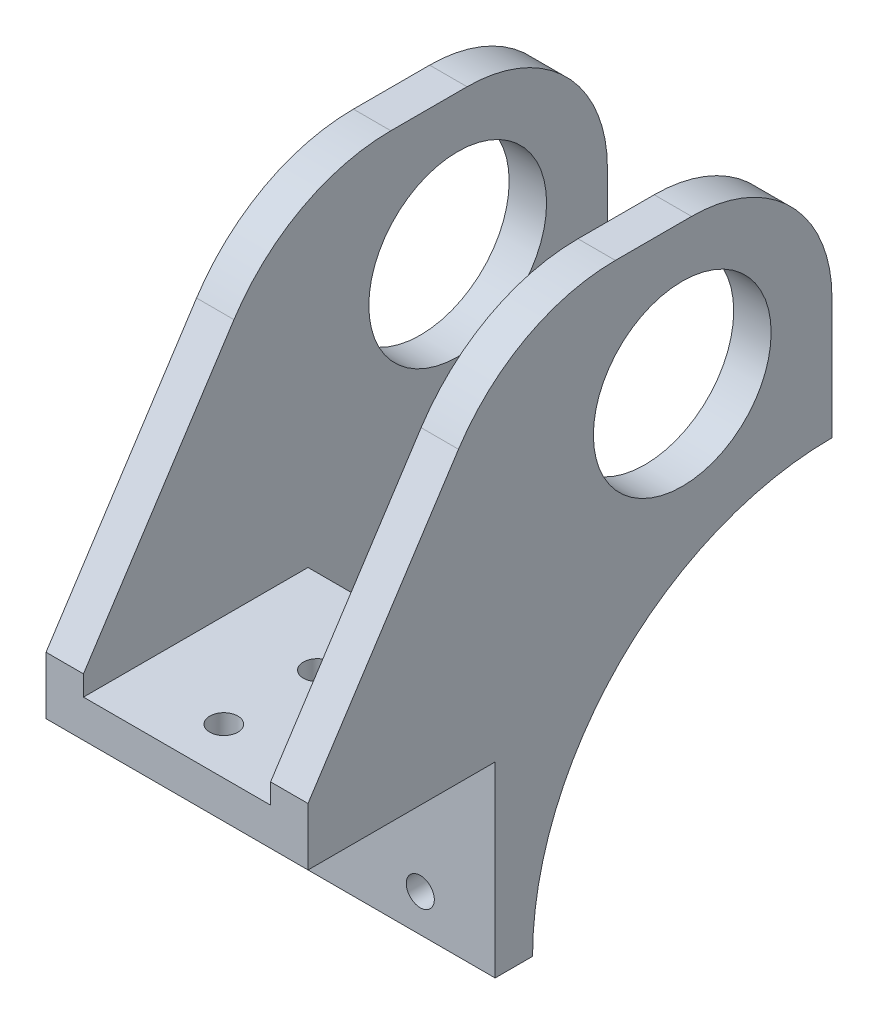
ISO-10303-21;
HEADER;
FILE_DESCRIPTION(('STEP AP214'),'2;1');
FILE_NAME('part.step','',(''),(''),'','','');
FILE_SCHEMA(('AUTOMOTIVE_DESIGN { 1 0 10303 214 1 1 1 1 }'));
ENDSEC;
DATA;
#1=APPLICATION_CONTEXT('core data for automotive mechanical design processes');
#2=APPLICATION_PROTOCOL_DEFINITION('international standard','automotive_design',2000,#1);
#3=PRODUCT_CONTEXT('',#1,'mechanical');
#4=PRODUCT('Part','Part','',(#3));
#5=PRODUCT_RELATED_PRODUCT_CATEGORY('part','',(#4));
#6=PRODUCT_DEFINITION_FORMATION('','',#4);
#7=PRODUCT_DEFINITION_CONTEXT('part definition',#1,'design');
#8=PRODUCT_DEFINITION('design','',#6,#7);
#9=PRODUCT_DEFINITION_SHAPE('','',#8);
#10=(LENGTH_UNIT() NAMED_UNIT(*) SI_UNIT(.MILLI.,.METRE.));
#11=(NAMED_UNIT(*) PLANE_ANGLE_UNIT() SI_UNIT($,.RADIAN.));
#12=(NAMED_UNIT(*) SI_UNIT($,.STERADIAN.) SOLID_ANGLE_UNIT());
#13=UNCERTAINTY_MEASURE_WITH_UNIT(LENGTH_MEASURE(1.E-05),#10,'distance_accuracy_value','');
#14=(GEOMETRIC_REPRESENTATION_CONTEXT(3) GLOBAL_UNCERTAINTY_ASSIGNED_CONTEXT((#13)) GLOBAL_UNIT_ASSIGNED_CONTEXT((#10,
#11,#12)) REPRESENTATION_CONTEXT('',''));
#15=CARTESIAN_POINT('',(0.,0.,0.));
#16=DIRECTION('',(0.,0.,1.));
#17=DIRECTION('',(1.,0.,0.));
#18=AXIS2_PLACEMENT_3D('',#15,#16,#17);
#19=CARTESIAN_POINT('',(52.,-2.00000000000001,-7.99961894323343));
#20=DIRECTION('',(0.,-0.544991158096032,-0.838441791418549));
#21=DIRECTION('',(0.,0.838441791418549,-0.544991158096032));
#22=AXIS2_PLACEMENT_3D('',#19,#20,#21);
#23=PLANE('',#22);
#24=DIRECTION('',(0.,-0.838441791418549,0.544991158096032));
#25=VECTOR('',#24,1.);
#26=CARTESIAN_POINT('',(22.,-2.00000000000001,-7.99961894323343));
#27=LINE('',#26,#25);
#28=CARTESIAN_POINT('',(22.,28.8998231619206,-28.0846511808156));
#29=VERTEX_POINT('',#28);
#30=CARTESIAN_POINT('',(22.,4.15380105870128,-11.9996189432334));
#31=VERTEX_POINT('',#30);
#32=EDGE_CURVE('E237',#29,#31,#27,.T.);
#33=ORIENTED_EDGE('',*,*,#32,.T.);
#34=DIRECTION('',(1.,0.,0.));
#35=VECTOR('',#34,1.);
#36=CARTESIAN_POINT('',(52.,4.15380105870128,-11.9996189432334));
#37=LINE('',#36,#35);
#38=CARTESIAN_POINT('',(26.,4.15380105870127,-11.9996189432334));
#39=VERTEX_POINT('',#38);
#40=EDGE_CURVE('E189',#31,#39,#37,.T.);
#41=ORIENTED_EDGE('',*,*,#40,.T.);
#42=DIRECTION('',(0.,0.838441791418549,-0.544991158096032));
#43=VECTOR('',#42,1.);
#44=CARTESIAN_POINT('',(26.,-4.24940350665579,-6.53749594952683));
#45=LINE('',#44,#43);
#46=CARTESIAN_POINT('',(26.,28.8998231619206,-28.0846511808156));
#47=VERTEX_POINT('',#46);
#48=EDGE_CURVE('E309',#39,#47,#45,.T.);
#49=ORIENTED_EDGE('',*,*,#48,.T.);
#50=DIRECTION('',(-1.,0.,0.));
#51=VECTOR('',#50,1.);
#52=CARTESIAN_POINT('',(52.,28.8998231619206,-28.0846511808156));
#53=LINE('',#52,#51);
#54=EDGE_CURVE('E322',#47,#29,#53,.T.);
#55=ORIENTED_EDGE('',*,*,#54,.T.);
#56=EDGE_LOOP('',(#33,#41,#49,#55));
#57=FACE_BOUND('',#56,.T.);
#58=ADVANCED_FACE('F39',(#57),#23,.F.);
#59=CARTESIAN_POINT('',(0.,0.,-36.));
#60=DIRECTION('',(0.,0.,1.));
#61=DIRECTION('',(1.,0.,0.));
#62=AXIS2_PLACEMENT_3D('',#59,#60,#61);
#63=PLANE('',#62);
#64=CARTESIAN_POINT('',(30.0000000000001,-17.9999999999999,-36.));
#65=DIRECTION('',(0.,0.,1.));
#66=DIRECTION('',(1.,0.,0.));
#67=AXIS2_PLACEMENT_3D('',#64,#65,#66);
#68=CIRCLE('',#67,1.50000000000001);
#69=CARTESIAN_POINT('',(31.5000000000001,-17.9999999999999,-36.));
#70=VERTEX_POINT('',#69);
#71=EDGE_CURVE('E258',#70,#70,#68,.T.);
#72=ORIENTED_EDGE('',*,*,#71,.T.);
#73=EDGE_LOOP('',(#72));
#74=FACE_BOUND('',#73,.T.);
#75=CARTESIAN_POINT('',(42.0000000000001,-17.9999999999999,-36.));
#76=DIRECTION('',(0.,0.,1.));
#77=DIRECTION('',(1.,0.,0.));
#78=AXIS2_PLACEMENT_3D('',#75,#76,#77);
#79=CIRCLE('',#78,1.5);
#80=CARTESIAN_POINT('',(43.5000000000001,-17.9999999999999,-36.));
#81=VERTEX_POINT('',#80);
#82=EDGE_CURVE('E254',#81,#81,#79,.T.);
#83=ORIENTED_EDGE('',*,*,#82,.T.);
#84=EDGE_LOOP('',(#83));
#85=FACE_BOUND('',#84,.T.);
#86=CARTESIAN_POINT('',(42.,-5.99999999999986,-36.));
#87=DIRECTION('',(0.,0.,1.));
#88=DIRECTION('',(1.,0.,0.));
#89=AXIS2_PLACEMENT_3D('',#86,#87,#88);
#90=CIRCLE('',#89,1.5);
#91=CARTESIAN_POINT('',(43.5,-5.99999999999986,-36.));
#92=VERTEX_POINT('',#91);
#93=EDGE_CURVE('E250',#92,#92,#90,.T.);
#94=ORIENTED_EDGE('',*,*,#93,.T.);
#95=EDGE_LOOP('',(#94));
#96=FACE_BOUND('',#95,.T.);
#97=CARTESIAN_POINT('',(30.,-6.00000000000001,-36.));
#98=DIRECTION('',(0.,0.,1.));
#99=DIRECTION('',(1.,0.,0.));
#100=AXIS2_PLACEMENT_3D('',#97,#98,#99);
#101=CIRCLE('',#100,1.5);
#102=CARTESIAN_POINT('',(31.5,-6.00000000000001,-36.));
#103=VERTEX_POINT('',#102);
#104=EDGE_CURVE('E246',#103,#103,#101,.T.);
#105=ORIENTED_EDGE('',*,*,#104,.T.);
#106=EDGE_LOOP('',(#105));
#107=FACE_BOUND('',#106,.T.);
#108=DIRECTION('',(0.,-1.,0.));
#109=VECTOR('',#108,1.);
#110=CARTESIAN_POINT('',(46.,2.,-36.));
#111=LINE('',#110,#109);
#112=CARTESIAN_POINT('',(46.,2.,-36.));
#113=VERTEX_POINT('',#112);
#114=CARTESIAN_POINT('',(46.,-22.,-36.));
#115=VERTEX_POINT('',#114);
#116=EDGE_CURVE('E261',#113,#115,#111,.T.);
#117=ORIENTED_EDGE('',*,*,#116,.T.);
#118=DIRECTION('',(1.,0.,0.));
#119=VECTOR('',#118,1.);
#120=CARTESIAN_POINT('',(30.,-22.,-36.));
#121=LINE('',#120,#119);
#122=CARTESIAN_POINT('',(26.,-22.,-36.));
#123=VERTEX_POINT('',#122);
#124=EDGE_CURVE('E288',#123,#115,#121,.T.);
#125=ORIENTED_EDGE('',*,*,#124,.F.);
#126=DIRECTION('',(0.,1.,0.));
#127=VECTOR('',#126,1.);
#128=CARTESIAN_POINT('',(26.,1.99999999999999,-36.));
#129=LINE('',#128,#127);
#130=CARTESIAN_POINT('',(26.,1.99999999999999,-36.));
#131=VERTEX_POINT('',#130);
#132=EDGE_CURVE('E266',#123,#131,#129,.T.);
#133=ORIENTED_EDGE('',*,*,#132,.T.);
#134=DIRECTION('',(1.,0.,0.));
#135=VECTOR('',#134,1.);
#136=CARTESIAN_POINT('',(0.,2.,-36.));
#137=LINE('',#136,#135);
#138=EDGE_CURVE('E295',#131,#113,#137,.T.);
#139=ORIENTED_EDGE('',*,*,#138,.T.);
#140=EDGE_LOOP('',(#117,#125,#133,#139));
#141=FACE_BOUND('',#140,.T.);
#142=ADVANCED_FACE('F385',(#74,#85,#96,#107,#141),#63,.F.);
#143=CARTESIAN_POINT('',(30.,38.,40.));
#144=DIRECTION('',(0.,-1.,0.));
#145=DIRECTION('',(0.,0.,-1.));
#146=AXIS2_PLACEMENT_3D('',#143,#144,#145);
#147=PLANE('',#146);
#148=DIRECTION('',(0.,0.,1.));
#149=VECTOR('',#148,1.);
#150=CARTESIAN_POINT('',(26.,38.,-58.));
#151=LINE('',#150,#149);
#152=CARTESIAN_POINT('',(26.,38.,-53.));
#153=VERTEX_POINT('',#152);
#154=CARTESIAN_POINT('',(26.,38.,-44.8534870091866));
#155=VERTEX_POINT('',#154);
#156=EDGE_CURVE('E271',#153,#155,#151,.T.);
#157=ORIENTED_EDGE('',*,*,#156,.F.);
#158=DIRECTION('',(1.,0.,0.));
#159=VECTOR('',#158,1.);
#160=CARTESIAN_POINT('',(22.,38.,-53.));
#161=LINE('',#160,#159);
#162=CARTESIAN_POINT('',(22.,38.,-53.));
#163=VERTEX_POINT('',#162);
#164=EDGE_CURVE('E47',#153,#163,#161,.F.);
#165=ORIENTED_EDGE('',*,*,#164,.T.);
#166=DIRECTION('',(0.,0.,-1.));
#167=VECTOR('',#166,1.);
#168=CARTESIAN_POINT('',(22.,38.,-7.99961894323343));
#169=LINE('',#168,#167);
#170=CARTESIAN_POINT('',(22.,38.,-44.8534870091866));
#171=VERTEX_POINT('',#170);
#172=EDGE_CURVE('E273',#171,#163,#169,.T.);
#173=ORIENTED_EDGE('',*,*,#172,.F.);
#174=DIRECTION('',(-1.,0.,0.));
#175=VECTOR('',#174,1.);
#176=CARTESIAN_POINT('',(30.,38.,-44.8534870091866));
#177=LINE('',#176,#175);
#178=EDGE_CURVE('E327',#171,#155,#177,.F.);
#179=ORIENTED_EDGE('',*,*,#178,.T.);
#180=EDGE_LOOP('',(#157,#165,#173,#179));
#181=FACE_BOUND('',#180,.T.);
#182=ADVANCED_FACE('F394',(#181),#147,.F.);
#183=CARTESIAN_POINT('',(0.,-2.00000000000001,0.));
#184=DIRECTION('',(0.,-1.,0.));
#185=DIRECTION('',(1.,0.,0.));
#186=AXIS2_PLACEMENT_3D('',#183,#184,#185);
#187=PLANE('',#186);
#188=CARTESIAN_POINT('',(36.,-2.,-16.9996189432334));
#189=DIRECTION('',(0.,-1.,0.));
#190=DIRECTION('',(1.,0.,0.));
#191=AXIS2_PLACEMENT_3D('',#188,#189,#190);
#192=CIRCLE('',#191,1.5);
#193=CARTESIAN_POINT('',(37.5,-2.,-16.9996189432334));
#194=VERTEX_POINT('',#193);
#195=EDGE_CURVE('E216',#194,#194,#192,.T.);
#196=ORIENTED_EDGE('',*,*,#195,.F.);
#197=EDGE_LOOP('',(#196));
#198=FACE_BOUND('',#197,.T.);
#199=CARTESIAN_POINT('',(36.,-2.,-26.9996189432334));
#200=DIRECTION('',(0.,-1.,0.));
#201=DIRECTION('',(1.,0.,0.));
#202=AXIS2_PLACEMENT_3D('',#199,#200,#201);
#203=CIRCLE('',#202,1.5);
#204=CARTESIAN_POINT('',(37.5,-2.,-26.9996189432334));
#205=VERTEX_POINT('',#204);
#206=EDGE_CURVE('E215',#205,#205,#203,.T.);
#207=ORIENTED_EDGE('',*,*,#206,.F.);
#208=EDGE_LOOP('',(#207));
#209=FACE_BOUND('',#208,.T.);
#210=DIRECTION('',(1.,0.,0.));
#211=VECTOR('',#210,1.);
#212=CARTESIAN_POINT('',(22.,-2.00000000000001,-11.9996189432334));
#213=LINE('',#212,#211);
#214=CARTESIAN_POINT('',(22.,-2.00000000000001,-11.9996189432334));
#215=VERTEX_POINT('',#214);
#216=CARTESIAN_POINT('',(50.,-2.,-11.9996189432334));
#217=VERTEX_POINT('',#216);
#218=EDGE_CURVE('E222',#215,#217,#213,.T.);
#219=ORIENTED_EDGE('',*,*,#218,.F.);
#220=DIRECTION('',(0.,0.,1.));
#221=VECTOR('',#220,1.);
#222=CARTESIAN_POINT('',(22.,-2.,-32.));
#223=LINE('',#222,#221);
#224=CARTESIAN_POINT('',(22.,-2.,-32.));
#225=VERTEX_POINT('',#224);
#226=EDGE_CURVE('E281',#225,#215,#223,.T.);
#227=ORIENTED_EDGE('',*,*,#226,.F.);
#228=DIRECTION('',(-1.,0.,0.));
#229=VECTOR('',#228,1.);
#230=CARTESIAN_POINT('',(30.,-2.,-32.));
#231=LINE('',#230,#229);
#232=CARTESIAN_POINT('',(50.,-2.,-32.));
#233=VERTEX_POINT('',#232);
#234=EDGE_CURVE('E284',#233,#225,#231,.T.);
#235=ORIENTED_EDGE('',*,*,#234,.F.);
#236=DIRECTION('',(0.,0.,1.));
#237=VECTOR('',#236,1.);
#238=CARTESIAN_POINT('',(50.,-2.,-40.));
#239=LINE('',#238,#237);
#240=EDGE_CURVE('E298',#233,#217,#239,.T.);
#241=ORIENTED_EDGE('',*,*,#240,.T.);
#242=EDGE_LOOP('',(#219,#227,#235,#241));
#243=FACE_BOUND('',#242,.T.);
#244=ADVANCED_FACE('F444',(#198,#209,#243),#187,.T.);
#245=CARTESIAN_POINT('',(50.,38.,40.));
#246=DIRECTION('',(-1.,0.,0.));
#247=DIRECTION('',(0.,-1.,0.));
#248=AXIS2_PLACEMENT_3D('',#245,#246,#247);
#249=PLANE('',#248);
#250=CARTESIAN_POINT('',(50.,23.,-51.9996189432334));
#251=DIRECTION('',(1.,0.,0.));
#252=DIRECTION('',(0.,1.,0.));
#253=AXIS2_PLACEMENT_3D('',#250,#251,#252);
#254=CIRCLE('',#253,9.5);
#255=CARTESIAN_POINT('',(50.,32.5,-51.9996189432334));
#256=VERTEX_POINT('',#255);
#257=EDGE_CURVE('E349',#256,#256,#254,.T.);
#258=ORIENTED_EDGE('',*,*,#257,.F.);
#259=EDGE_LOOP('',(#258));
#260=FACE_BOUND('',#259,.T.);
#261=DIRECTION('',(0.,-1.,0.));
#262=VECTOR('',#261,1.);
#263=CARTESIAN_POINT('',(50.,38.,-68.));
#264=LINE('',#263,#262);
#265=CARTESIAN_POINT('',(50.,23.,-68.));
#266=VERTEX_POINT('',#265);
#267=CARTESIAN_POINT('',(50.,10.,-68.));
#268=VERTEX_POINT('',#267);
#269=EDGE_CURVE('E170',#266,#268,#264,.T.);
#270=ORIENTED_EDGE('',*,*,#269,.F.);
#271=CARTESIAN_POINT('',(50.,23.,-53.));
#272=DIRECTION('',(-1.,0.,0.));
#273=DIRECTION('',(0.,-1.,0.));
#274=AXIS2_PLACEMENT_3D('',#271,#272,#273);
#275=CIRCLE('',#274,15.);
#276=CARTESIAN_POINT('',(50.,38.,-53.));
#277=VERTEX_POINT('',#276);
#278=EDGE_CURVE('E351',#266,#277,#275,.F.);
#279=ORIENTED_EDGE('',*,*,#278,.T.);
#280=DIRECTION('',(0.,0.,-1.));
#281=VECTOR('',#280,1.);
#282=CARTESIAN_POINT('',(50.,38.,40.));
#283=LINE('',#282,#281);
#284=CARTESIAN_POINT('',(50.,38.,-44.8534870091866));
#285=VERTEX_POINT('',#284);
#286=EDGE_CURVE('E306',#285,#277,#283,.T.);
#287=ORIENTED_EDGE('',*,*,#286,.F.);
#288=CARTESIAN_POINT('',(50.,18.,-44.8534870091866));
#289=DIRECTION('',(-1.,0.,0.));
#290=DIRECTION('',(0.,-1.,0.));
#291=AXIS2_PLACEMENT_3D('',#288,#289,#290);
#292=CIRCLE('',#291,20.);
#293=CARTESIAN_POINT('',(50.,28.8998231619206,-28.0846511808156));
#294=VERTEX_POINT('',#293);
#295=EDGE_CURVE('E337',#285,#294,#292,.F.);
#296=ORIENTED_EDGE('',*,*,#295,.T.);
#297=DIRECTION('',(0.,-0.838441791418549,0.544991158096032));
#298=VECTOR('',#297,1.);
#299=CARTESIAN_POINT('',(50.,4.18627820598348,-12.0207292436623));
#300=LINE('',#299,#298);
#301=CARTESIAN_POINT('',(50.,4.15380105870127,-11.9996189432334));
#302=VERTEX_POINT('',#301);
#303=EDGE_CURVE('E242',#294,#302,#300,.T.);
#304=ORIENTED_EDGE('',*,*,#303,.T.);
#305=DIRECTION('',(0.,-1.,0.));
#306=VECTOR('',#305,1.);
#307=CARTESIAN_POINT('',(50.,8.,-11.9996189432334));
#308=LINE('',#307,#306);
#309=EDGE_CURVE('E226',#302,#217,#308,.T.);
#310=ORIENTED_EDGE('',*,*,#309,.T.);
#311=ORIENTED_EDGE('',*,*,#240,.F.);
#312=DIRECTION('',(0.,1.,0.));
#313=VECTOR('',#312,1.);
#314=CARTESIAN_POINT('',(50.,-22.,-32.));
#315=LINE('',#314,#313);
#316=CARTESIAN_POINT('',(50.,-22.,-32.));
#317=VERTEX_POINT('',#316);
#318=EDGE_CURVE('E292',#317,#233,#315,.T.);
#319=ORIENTED_EDGE('',*,*,#318,.F.);
#320=DIRECTION('',(0.,0.,1.));
#321=VECTOR('',#320,1.);
#322=CARTESIAN_POINT('',(50.,-22.,-36.));
#323=LINE('',#322,#321);
#324=CARTESIAN_POINT('',(50.,-22.,-36.));
#325=VERTEX_POINT('',#324);
#326=EDGE_CURVE('E194',#325,#317,#323,.T.);
#327=ORIENTED_EDGE('',*,*,#326,.F.);
#328=CARTESIAN_POINT('',(50.,-22.,-68.));
#329=DIRECTION('',(1.,0.,0.));
#330=DIRECTION('',(0.,1.,0.));
#331=AXIS2_PLACEMENT_3D('',#328,#329,#330);
#332=CIRCLE('',#331,32.);
#333=EDGE_CURVE('E185',#268,#325,#332,.T.);
#334=ORIENTED_EDGE('',*,*,#333,.F.);
#335=EDGE_LOOP('',(#270,#279,#287,#296,#304,#310,#311,#319,#327,#334));
#336=FACE_BOUND('',#335,.T.);
#337=ADVANCED_FACE('F192',(#260,#336),#249,.F.);
#338=CARTESIAN_POINT('',(46.,0.,40.));
#339=DIRECTION('',(1.,0.,0.));
#340=DIRECTION('',(0.,0.,-1.));
#341=AXIS2_PLACEMENT_3D('',#338,#339,#340);
#342=PLANE('',#341);
#343=CARTESIAN_POINT('',(46.,23.,-51.9996189432334));
#344=DIRECTION('',(1.,0.,0.));
#345=DIRECTION('',(0.,0.,-1.));
#346=AXIS2_PLACEMENT_3D('',#343,#344,#345);
#347=CIRCLE('',#346,9.5);
#348=CARTESIAN_POINT('',(46.,23.,-61.4996189432334));
#349=VERTEX_POINT('',#348);
#350=EDGE_CURVE('E195',#349,#349,#347,.T.);
#351=ORIENTED_EDGE('',*,*,#350,.T.);
#352=EDGE_LOOP('',(#351));
#353=FACE_BOUND('',#352,.T.);
#354=DIRECTION('',(0.,0.,-1.));
#355=VECTOR('',#354,1.);
#356=CARTESIAN_POINT('',(46.,38.,40.));
#357=LINE('',#356,#355);
#358=CARTESIAN_POINT('',(46.,38.,-44.8534870091866));
#359=VERTEX_POINT('',#358);
#360=CARTESIAN_POINT('',(46.,38.,-53.));
#361=VERTEX_POINT('',#360);
#362=EDGE_CURVE('E303',#359,#361,#357,.T.);
#363=ORIENTED_EDGE('',*,*,#362,.T.);
#364=CARTESIAN_POINT('',(46.,23.,-53.));
#365=DIRECTION('',(1.,0.,0.));
#366=DIRECTION('',(0.,0.,-1.));
#367=AXIS2_PLACEMENT_3D('',#364,#365,#366);
#368=CIRCLE('',#367,15.);
#369=CARTESIAN_POINT('',(46.,23.,-68.));
#370=VERTEX_POINT('',#369);
#371=EDGE_CURVE('E355',#361,#370,#368,.F.);
#372=ORIENTED_EDGE('',*,*,#371,.T.);
#373=DIRECTION('',(0.,1.,0.));
#374=VECTOR('',#373,1.);
#375=CARTESIAN_POINT('',(46.,2.,-68.));
#376=LINE('',#375,#374);
#377=CARTESIAN_POINT('',(46.,10.,-68.));
#378=VERTEX_POINT('',#377);
#379=EDGE_CURVE('E181',#378,#370,#376,.T.);
#380=ORIENTED_EDGE('',*,*,#379,.F.);
#381=CARTESIAN_POINT('',(46.,-22.,-68.));
#382=DIRECTION('',(1.,0.,0.));
#383=DIRECTION('',(0.,0.,-1.));
#384=AXIS2_PLACEMENT_3D('',#381,#382,#383);
#385=CIRCLE('',#384,32.);
#386=EDGE_CURVE('E188',#378,#115,#385,.T.);
#387=ORIENTED_EDGE('',*,*,#386,.T.);
#388=ORIENTED_EDGE('',*,*,#116,.F.);
#389=DIRECTION('',(0.,0.,-1.));
#390=VECTOR('',#389,1.);
#391=CARTESIAN_POINT('',(46.,2.,-3.99961894323343));
#392=LINE('',#391,#390);
#393=CARTESIAN_POINT('',(46.,2.,-11.9996189432334));
#394=VERTEX_POINT('',#393);
#395=EDGE_CURVE('E301',#394,#113,#392,.T.);
#396=ORIENTED_EDGE('',*,*,#395,.F.);
#397=DIRECTION('',(0.,1.,0.));
#398=VECTOR('',#397,1.);
#399=CARTESIAN_POINT('',(46.,0.,-11.9996189432334));
#400=LINE('',#399,#398);
#401=CARTESIAN_POINT('',(46.,4.15380105870128,-11.9996189432334));
#402=VERTEX_POINT('',#401);
#403=EDGE_CURVE('E229',#394,#402,#400,.T.);
#404=ORIENTED_EDGE('',*,*,#403,.T.);
#405=DIRECTION('',(0.,0.838441791418549,-0.544991158096032));
#406=VECTOR('',#405,1.);
#407=CARTESIAN_POINT('',(46.,-22.5271380227081,5.34311854658733));
#408=LINE('',#407,#406);
#409=CARTESIAN_POINT('',(46.,28.8998231619206,-28.0846511808156));
#410=VERTEX_POINT('',#409);
#411=EDGE_CURVE('E240',#402,#410,#408,.T.);
#412=ORIENTED_EDGE('',*,*,#411,.T.);
#413=CARTESIAN_POINT('',(46.,18.,-44.8534870091866));
#414=DIRECTION('',(1.,0.,0.));
#415=DIRECTION('',(0.,0.,-1.));
#416=AXIS2_PLACEMENT_3D('',#413,#414,#415);
#417=CIRCLE('',#416,20.);
#418=EDGE_CURVE('E333',#410,#359,#417,.F.);
#419=ORIENTED_EDGE('',*,*,#418,.T.);
#420=EDGE_LOOP('',(#363,#372,#380,#387,#388,#396,#404,#412,#419));
#421=FACE_BOUND('',#420,.T.);
#422=ADVANCED_FACE('F418',(#353,#421),#342,.F.);
#423=CARTESIAN_POINT('',(0.,2.,0.));
#424=DIRECTION('',(0.,1.,0.));
#425=DIRECTION('',(0.,0.,1.));
#426=AXIS2_PLACEMENT_3D('',#423,#424,#425);
#427=PLANE('',#426);
#428=CARTESIAN_POINT('',(36.,2.,-16.9996189432334));
#429=DIRECTION('',(0.,1.,0.));
#430=DIRECTION('',(0.,0.,1.));
#431=AXIS2_PLACEMENT_3D('',#428,#429,#430);
#432=CIRCLE('',#431,1.5);
#433=CARTESIAN_POINT('',(36.,2.,-15.4996189432334));
#434=VERTEX_POINT('',#433);
#435=EDGE_CURVE('E225',#434,#434,#432,.T.);
#436=ORIENTED_EDGE('',*,*,#435,.F.);
#437=EDGE_LOOP('',(#436));
#438=FACE_BOUND('',#437,.T.);
#439=CARTESIAN_POINT('',(36.,2.,-26.9996189432334));
#440=DIRECTION('',(0.,1.,0.));
#441=DIRECTION('',(0.,0.,1.));
#442=AXIS2_PLACEMENT_3D('',#439,#440,#441);
#443=CIRCLE('',#442,1.5);
#444=CARTESIAN_POINT('',(36.,2.,-25.4996189432334));
#445=VERTEX_POINT('',#444);
#446=EDGE_CURVE('E219',#445,#445,#443,.T.);
#447=ORIENTED_EDGE('',*,*,#446,.F.);
#448=EDGE_LOOP('',(#447));
#449=FACE_BOUND('',#448,.T.);
#450=DIRECTION('',(-1.,0.,0.));
#451=VECTOR('',#450,1.);
#452=CARTESIAN_POINT('',(0.,2.,-11.9996189432334));
#453=LINE('',#452,#451);
#454=CARTESIAN_POINT('',(26.,2.,-11.9996189432334));
#455=VERTEX_POINT('',#454);
#456=EDGE_CURVE('E233',#394,#455,#453,.T.);
#457=ORIENTED_EDGE('',*,*,#456,.F.);
#458=ORIENTED_EDGE('',*,*,#395,.T.);
#459=ORIENTED_EDGE('',*,*,#138,.F.);
#460=DIRECTION('',(0.,0.,-1.));
#461=VECTOR('',#460,1.);
#462=CARTESIAN_POINT('',(26.,2.,-7.99961894323343));
#463=LINE('',#462,#461);
#464=EDGE_CURVE('E269',#455,#131,#463,.T.);
#465=ORIENTED_EDGE('',*,*,#464,.F.);
#466=EDGE_LOOP('',(#457,#458,#459,#465));
#467=FACE_BOUND('',#466,.T.);
#468=ADVANCED_FACE('F458',(#438,#449,#467),#427,.T.);
#469=CARTESIAN_POINT('',(46.,38.,40.));
#470=DIRECTION('',(0.,-1.,0.));
#471=DIRECTION('',(0.,0.,-1.));
#472=AXIS2_PLACEMENT_3D('',#469,#470,#471);
#473=PLANE('',#472);
#474=ORIENTED_EDGE('',*,*,#286,.T.);
#475=DIRECTION('',(1.,0.,0.));
#476=VECTOR('',#475,1.);
#477=CARTESIAN_POINT('',(46.,38.,-53.));
#478=LINE('',#477,#476);
#479=EDGE_CURVE('E353',#277,#361,#478,.F.);
#480=ORIENTED_EDGE('',*,*,#479,.T.);
#481=ORIENTED_EDGE('',*,*,#362,.F.);
#482=DIRECTION('',(-1.,0.,0.));
#483=VECTOR('',#482,1.);
#484=CARTESIAN_POINT('',(46.,38.,-44.8534870091866));
#485=LINE('',#484,#483);
#486=EDGE_CURVE('E335',#359,#285,#485,.F.);
#487=ORIENTED_EDGE('',*,*,#486,.T.);
#488=EDGE_LOOP('',(#474,#480,#481,#487));
#489=FACE_BOUND('',#488,.T.);
#490=ADVANCED_FACE('F426',(#489),#473,.F.);
#491=CARTESIAN_POINT('',(30.,-22.,-32.));
#492=DIRECTION('',(0.,0.,-1.));
#493=DIRECTION('',(-1.,0.,0.));
#494=AXIS2_PLACEMENT_3D('',#491,#492,#493);
#495=PLANE('',#494);
#496=CARTESIAN_POINT('',(30.0000000000001,-17.9999999999999,-32.));
#497=DIRECTION('',(0.,0.,-1.));
#498=DIRECTION('',(-1.,0.,0.));
#499=AXIS2_PLACEMENT_3D('',#496,#497,#498);
#500=CIRCLE('',#499,1.50000000000001);
#501=CARTESIAN_POINT('',(28.5000000000001,-17.9999999999999,-32.));
#502=VERTEX_POINT('',#501);
#503=EDGE_CURVE('E257',#502,#502,#500,.T.);
#504=ORIENTED_EDGE('',*,*,#503,.T.);
#505=EDGE_LOOP('',(#504));
#506=FACE_BOUND('',#505,.T.);
#507=CARTESIAN_POINT('',(42.0000000000001,-17.9999999999999,-32.));
#508=DIRECTION('',(0.,0.,-1.));
#509=DIRECTION('',(-1.,0.,0.));
#510=AXIS2_PLACEMENT_3D('',#507,#508,#509);
#511=CIRCLE('',#510,1.5);
#512=CARTESIAN_POINT('',(40.5000000000001,-17.9999999999999,-32.));
#513=VERTEX_POINT('',#512);
#514=EDGE_CURVE('E253',#513,#513,#511,.T.);
#515=ORIENTED_EDGE('',*,*,#514,.T.);
#516=EDGE_LOOP('',(#515));
#517=FACE_BOUND('',#516,.T.);
#518=CARTESIAN_POINT('',(42.,-5.99999999999986,-32.));
#519=DIRECTION('',(0.,0.,-1.));
#520=DIRECTION('',(-1.,0.,0.));
#521=AXIS2_PLACEMENT_3D('',#518,#519,#520);
#522=CIRCLE('',#521,1.5);
#523=CARTESIAN_POINT('',(40.5,-5.99999999999986,-32.));
#524=VERTEX_POINT('',#523);
#525=EDGE_CURVE('E249',#524,#524,#522,.T.);
#526=ORIENTED_EDGE('',*,*,#525,.T.);
#527=EDGE_LOOP('',(#526));
#528=FACE_BOUND('',#527,.T.);
#529=CARTESIAN_POINT('',(30.,-6.00000000000001,-32.));
#530=DIRECTION('',(0.,0.,-1.));
#531=DIRECTION('',(-1.,0.,0.));
#532=AXIS2_PLACEMENT_3D('',#529,#530,#531);
#533=CIRCLE('',#532,1.5);
#534=CARTESIAN_POINT('',(28.5,-6.00000000000001,-32.));
#535=VERTEX_POINT('',#534);
#536=EDGE_CURVE('E245',#535,#535,#533,.T.);
#537=ORIENTED_EDGE('',*,*,#536,.T.);
#538=EDGE_LOOP('',(#537));
#539=FACE_BOUND('',#538,.T.);
#540=ORIENTED_EDGE('',*,*,#234,.T.);
#541=DIRECTION('',(0.,1.,0.));
#542=VECTOR('',#541,1.);
#543=CARTESIAN_POINT('',(22.,-22.,-32.));
#544=LINE('',#543,#542);
#545=CARTESIAN_POINT('',(22.,-22.,-32.));
#546=VERTEX_POINT('',#545);
#547=EDGE_CURVE('E278',#546,#225,#544,.T.);
#548=ORIENTED_EDGE('',*,*,#547,.F.);
#549=DIRECTION('',(-1.,0.,0.));
#550=VECTOR('',#549,1.);
#551=CARTESIAN_POINT('',(30.,-22.,-32.));
#552=LINE('',#551,#550);
#553=EDGE_CURVE('E290',#317,#546,#552,.T.);
#554=ORIENTED_EDGE('',*,*,#553,.F.);
#555=ORIENTED_EDGE('',*,*,#318,.T.);
#556=EDGE_LOOP('',(#540,#548,#554,#555));
#557=FACE_BOUND('',#556,.T.);
#558=ADVANCED_FACE('F439',(#506,#517,#528,#539,#557),#495,.F.);
#559=CARTESIAN_POINT('',(0.,-22.,0.));
#560=DIRECTION('',(0.,1.,0.));
#561=DIRECTION('',(-1.,0.,0.));
#562=AXIS2_PLACEMENT_3D('',#559,#560,#561);
#563=PLANE('',#562);
#564=ORIENTED_EDGE('',*,*,#553,.T.);
#565=DIRECTION('',(0.,0.,1.));
#566=VECTOR('',#565,1.);
#567=CARTESIAN_POINT('',(22.,-22.,-36.));
#568=LINE('',#567,#566);
#569=CARTESIAN_POINT('',(22.,-22.,-36.));
#570=VERTEX_POINT('',#569);
#571=EDGE_CURVE('E275',#570,#546,#568,.T.);
#572=ORIENTED_EDGE('',*,*,#571,.F.);
#573=EDGE_CURVE('E285',#570,#123,#121,.T.);
#574=ORIENTED_EDGE('',*,*,#573,.T.);
#575=ORIENTED_EDGE('',*,*,#124,.T.);
#576=DIRECTION('',(1.,0.,0.));
#577=VECTOR('',#576,1.);
#578=CARTESIAN_POINT('',(46.,-22.,-36.));
#579=LINE('',#578,#577);
#580=EDGE_CURVE('E264',#115,#325,#579,.T.);
#581=ORIENTED_EDGE('',*,*,#580,.T.);
#582=ORIENTED_EDGE('',*,*,#326,.T.);
#583=EDGE_LOOP('',(#564,#572,#574,#575,#581,#582));
#584=FACE_BOUND('',#583,.T.);
#585=ADVANCED_FACE('F434',(#584),#563,.F.);
#586=CARTESIAN_POINT('',(22.,0.,0.));
#587=DIRECTION('',(-1.,0.,0.));
#588=DIRECTION('',(0.,0.,1.));
#589=AXIS2_PLACEMENT_3D('',#586,#587,#588);
#590=PLANE('',#589);
#591=CARTESIAN_POINT('',(22.,23.,-51.9996189432334));
#592=DIRECTION('',(-1.,0.,0.));
#593=DIRECTION('',(0.,0.,1.));
#594=AXIS2_PLACEMENT_3D('',#591,#592,#593);
#595=CIRCLE('',#594,9.5);
#596=CARTESIAN_POINT('',(22.,23.,-42.4996189432334));
#597=VERTEX_POINT('',#596);
#598=EDGE_CURVE('E200',#597,#597,#595,.T.);
#599=ORIENTED_EDGE('',*,*,#598,.F.);
#600=EDGE_LOOP('',(#599));
#601=FACE_BOUND('',#600,.T.);
#602=ORIENTED_EDGE('',*,*,#172,.T.);
#603=CARTESIAN_POINT('',(22.,23.,-53.));
#604=DIRECTION('',(-1.,0.,0.));
#605=DIRECTION('',(0.,0.,1.));
#606=AXIS2_PLACEMENT_3D('',#603,#604,#605);
#607=CIRCLE('',#606,15.);
#608=CARTESIAN_POINT('',(22.,23.,-68.));
#609=VERTEX_POINT('',#608);
#610=EDGE_CURVE('E11',#163,#609,#607,.T.);
#611=ORIENTED_EDGE('',*,*,#610,.T.);
#612=DIRECTION('',(0.,1.,0.));
#613=VECTOR('',#612,1.);
#614=CARTESIAN_POINT('',(22.,1.99999999999999,-68.));
#615=LINE('',#614,#613);
#616=CARTESIAN_POINT('',(22.,10.,-68.));
#617=VERTEX_POINT('',#616);
#618=EDGE_CURVE('E180',#617,#609,#615,.T.);
#619=ORIENTED_EDGE('',*,*,#618,.F.);
#620=CARTESIAN_POINT('',(22.,-22.,-68.));
#621=DIRECTION('',(-1.,0.,0.));
#622=DIRECTION('',(0.,0.,1.));
#623=AXIS2_PLACEMENT_3D('',#620,#621,#622);
#624=CIRCLE('',#623,32.);
#625=EDGE_CURVE('E197',#570,#617,#624,.T.);
#626=ORIENTED_EDGE('',*,*,#625,.F.);
#627=ORIENTED_EDGE('',*,*,#571,.T.);
#628=ORIENTED_EDGE('',*,*,#547,.T.);
#629=ORIENTED_EDGE('',*,*,#226,.T.);
#630=DIRECTION('',(0.,-1.,0.));
#631=VECTOR('',#630,1.);
#632=CARTESIAN_POINT('',(22.,7.99999999999999,-11.9996189432334));
#633=LINE('',#632,#631);
#634=EDGE_CURVE('E224',#31,#215,#633,.T.);
#635=ORIENTED_EDGE('',*,*,#634,.F.);
#636=ORIENTED_EDGE('',*,*,#32,.F.);
#637=CARTESIAN_POINT('',(22.,18.,-44.8534870091866));
#638=DIRECTION('',(-1.,0.,0.));
#639=DIRECTION('',(0.,0.,1.));
#640=AXIS2_PLACEMENT_3D('',#637,#638,#639);
#641=CIRCLE('',#640,20.);
#642=EDGE_CURVE('E325',#29,#171,#641,.T.);
#643=ORIENTED_EDGE('',*,*,#642,.T.);
#644=EDGE_LOOP('',(#602,#611,#619,#626,#627,#628,#629,#635,#636,#643));
#645=FACE_BOUND('',#644,.T.);
#646=ADVANCED_FACE('F375',(#601,#645),#590,.T.);
#647=CARTESIAN_POINT('',(26.,0.,0.));
#648=DIRECTION('',(1.,0.,0.));
#649=DIRECTION('',(0.,1.,0.));
#650=AXIS2_PLACEMENT_3D('',#647,#648,#649);
#651=PLANE('',#650);
#652=CARTESIAN_POINT('',(26.,23.,-51.9996189432334));
#653=DIRECTION('',(1.,0.,0.));
#654=DIRECTION('',(0.,1.,0.));
#655=AXIS2_PLACEMENT_3D('',#652,#653,#654);
#656=CIRCLE('',#655,9.5);
#657=CARTESIAN_POINT('',(26.,32.5,-51.9996189432334));
#658=VERTEX_POINT('',#657);
#659=EDGE_CURVE('E346',#658,#658,#656,.T.);
#660=ORIENTED_EDGE('',*,*,#659,.F.);
#661=EDGE_LOOP('',(#660));
#662=FACE_BOUND('',#661,.T.);
#663=DIRECTION('',(0.,-1.,0.));
#664=VECTOR('',#663,1.);
#665=CARTESIAN_POINT('',(26.,38.,-68.));
#666=LINE('',#665,#664);
#667=CARTESIAN_POINT('',(26.,23.,-68.));
#668=VERTEX_POINT('',#667);
#669=CARTESIAN_POINT('',(26.,10.,-68.));
#670=VERTEX_POINT('',#669);
#671=EDGE_CURVE('E213',#668,#670,#666,.T.);
#672=ORIENTED_EDGE('',*,*,#671,.F.);
#673=CARTESIAN_POINT('',(26.,23.,-53.));
#674=DIRECTION('',(1.,0.,0.));
#675=DIRECTION('',(0.,1.,0.));
#676=AXIS2_PLACEMENT_3D('',#673,#674,#675);
#677=CIRCLE('',#676,15.);
#678=EDGE_CURVE('E61',#668,#153,#677,.T.);
#679=ORIENTED_EDGE('',*,*,#678,.T.);
#680=ORIENTED_EDGE('',*,*,#156,.T.);
#681=CARTESIAN_POINT('',(26.,18.,-44.8534870091866));
#682=DIRECTION('',(1.,0.,0.));
#683=DIRECTION('',(0.,1.,0.));
#684=AXIS2_PLACEMENT_3D('',#681,#682,#683);
#685=CIRCLE('',#684,20.);
#686=EDGE_CURVE('E330',#155,#47,#685,.T.);
#687=ORIENTED_EDGE('',*,*,#686,.T.);
#688=ORIENTED_EDGE('',*,*,#48,.F.);
#689=DIRECTION('',(0.,1.,0.));
#690=VECTOR('',#689,1.);
#691=CARTESIAN_POINT('',(26.,0.,-11.9996189432334));
#692=LINE('',#691,#690);
#693=EDGE_CURVE('E235',#455,#39,#692,.T.);
#694=ORIENTED_EDGE('',*,*,#693,.F.);
#695=ORIENTED_EDGE('',*,*,#464,.T.);
#696=ORIENTED_EDGE('',*,*,#132,.F.);
#697=CARTESIAN_POINT('',(26.,-22.,-68.));
#698=DIRECTION('',(1.,0.,0.));
#699=DIRECTION('',(0.,1.,0.));
#700=AXIS2_PLACEMENT_3D('',#697,#698,#699);
#701=CIRCLE('',#700,32.);
#702=EDGE_CURVE('E208',#670,#123,#701,.T.);
#703=ORIENTED_EDGE('',*,*,#702,.F.);
#704=EDGE_LOOP('',(#672,#679,#680,#687,#688,#694,#695,#696,#703));
#705=FACE_BOUND('',#704,.T.);
#706=ADVANCED_FACE('F368',(#662,#705),#651,.T.);
#707=CARTESIAN_POINT('',(30.,-6.00000000000001,-37.9996189432334));
#708=DIRECTION('',(0.,0.,1.));
#709=DIRECTION('',(1.,0.,0.));
#710=AXIS2_PLACEMENT_3D('',#707,#708,#709);
#711=CYLINDRICAL_SURFACE('',#710,1.5);
#712=ORIENTED_EDGE('',*,*,#536,.F.);
#713=EDGE_LOOP('',(#712));
#714=FACE_BOUND('',#713,.T.);
#715=ORIENTED_EDGE('',*,*,#104,.F.);
#716=EDGE_LOOP('',(#715));
#717=FACE_BOUND('',#716,.T.);
#718=ADVANCED_FACE('F512',(#714,#717),#711,.F.);
#719=CARTESIAN_POINT('',(42.,-5.99999999999986,-37.9996189432334));
#720=DIRECTION('',(0.,0.,1.));
#721=DIRECTION('',(1.,0.,0.));
#722=AXIS2_PLACEMENT_3D('',#719,#720,#721);
#723=CYLINDRICAL_SURFACE('',#722,1.5);
#724=ORIENTED_EDGE('',*,*,#525,.F.);
#725=EDGE_LOOP('',(#724));
#726=FACE_BOUND('',#725,.T.);
#727=ORIENTED_EDGE('',*,*,#93,.F.);
#728=EDGE_LOOP('',(#727));
#729=FACE_BOUND('',#728,.T.);
#730=ADVANCED_FACE('F518',(#726,#729),#723,.F.);
#731=CARTESIAN_POINT('',(42.0000000000001,-17.9999999999999,-37.9996189432334));
#732=DIRECTION('',(0.,0.,1.));
#733=DIRECTION('',(1.,0.,0.));
#734=AXIS2_PLACEMENT_3D('',#731,#732,#733);
#735=CYLINDRICAL_SURFACE('',#734,1.5);
#736=ORIENTED_EDGE('',*,*,#514,.F.);
#737=EDGE_LOOP('',(#736));
#738=FACE_BOUND('',#737,.T.);
#739=ORIENTED_EDGE('',*,*,#82,.F.);
#740=EDGE_LOOP('',(#739));
#741=FACE_BOUND('',#740,.T.);
#742=ADVANCED_FACE('F410',(#738,#741),#735,.F.);
#743=CARTESIAN_POINT('',(30.0000000000001,-17.9999999999999,-37.9996189432334));
#744=DIRECTION('',(0.,0.,1.));
#745=DIRECTION('',(1.,0.,0.));
#746=AXIS2_PLACEMENT_3D('',#743,#744,#745);
#747=CYLINDRICAL_SURFACE('',#746,1.50000000000001);
#748=ORIENTED_EDGE('',*,*,#503,.F.);
#749=EDGE_LOOP('',(#748));
#750=FACE_BOUND('',#749,.T.);
#751=ORIENTED_EDGE('',*,*,#71,.F.);
#752=EDGE_LOOP('',(#751));
#753=FACE_BOUND('',#752,.T.);
#754=ADVANCED_FACE('F400',(#750,#753),#747,.F.);
#755=ORIENTED_EDGE('',*,*,#411,.F.);
#756=EDGE_CURVE('E339',#402,#302,#37,.T.);
#757=ORIENTED_EDGE('',*,*,#756,.T.);
#758=ORIENTED_EDGE('',*,*,#303,.F.);
#759=DIRECTION('',(-1.,0.,0.));
#760=VECTOR('',#759,1.);
#761=CARTESIAN_POINT('',(52.,28.8998231619206,-28.0846511808156));
#762=LINE('',#761,#760);
#763=EDGE_CURVE('E319',#294,#410,#762,.T.);
#764=ORIENTED_EDGE('',*,*,#763,.T.);
#765=EDGE_LOOP('',(#755,#757,#758,#764));
#766=FACE_BOUND('',#765,.T.);
#767=ADVANCED_FACE('F388',(#766),#23,.F.);
#768=CARTESIAN_POINT('',(52.,18.,-44.8534870091866));
#769=DIRECTION('',(-1.,0.,0.));
#770=DIRECTION('',(0.,0.,1.));
#771=AXIS2_PLACEMENT_3D('',#768,#769,#770);
#772=CYLINDRICAL_SURFACE('',#771,20.);
#773=ORIENTED_EDGE('',*,*,#686,.F.);
#774=ORIENTED_EDGE('',*,*,#178,.F.);
#775=ORIENTED_EDGE('',*,*,#642,.F.);
#776=ORIENTED_EDGE('',*,*,#54,.F.);
#777=EDGE_LOOP('',(#773,#774,#775,#776));
#778=FACE_BOUND('',#777,.T.);
#779=ADVANCED_FACE('F399',(#778),#772,.T.);
#780=CARTESIAN_POINT('',(52.,18.,-44.8534870091866));
#781=DIRECTION('',(-1.,0.,0.));
#782=DIRECTION('',(0.,0.,1.));
#783=AXIS2_PLACEMENT_3D('',#780,#781,#782);
#784=CYLINDRICAL_SURFACE('',#783,20.);
#785=ORIENTED_EDGE('',*,*,#295,.F.);
#786=ORIENTED_EDGE('',*,*,#486,.F.);
#787=ORIENTED_EDGE('',*,*,#418,.F.);
#788=ORIENTED_EDGE('',*,*,#763,.F.);
#789=EDGE_LOOP('',(#785,#786,#787,#788));
#790=FACE_BOUND('',#789,.T.);
#791=ADVANCED_FACE('F406',(#790),#784,.T.);
#792=CARTESIAN_POINT('',(22.,7.99999999999999,-11.9996189432334));
#793=DIRECTION('',(0.,0.,-1.));
#794=DIRECTION('',(-1.,0.,0.));
#795=AXIS2_PLACEMENT_3D('',#792,#793,#794);
#796=PLANE('',#795);
#797=ORIENTED_EDGE('',*,*,#634,.T.);
#798=ORIENTED_EDGE('',*,*,#218,.T.);
#799=ORIENTED_EDGE('',*,*,#309,.F.);
#800=ORIENTED_EDGE('',*,*,#756,.F.);
#801=ORIENTED_EDGE('',*,*,#403,.F.);
#802=ORIENTED_EDGE('',*,*,#456,.T.);
#803=ORIENTED_EDGE('',*,*,#693,.T.);
#804=ORIENTED_EDGE('',*,*,#40,.F.);
#805=EDGE_LOOP('',(#797,#798,#799,#800,#801,#802,#803,#804));
#806=FACE_BOUND('',#805,.T.);
#807=ADVANCED_FACE('F446',(#806),#796,.F.);
#808=CARTESIAN_POINT('',(36.,8.,-26.9996189432334));
#809=DIRECTION('',(0.,-1.,0.));
#810=DIRECTION('',(1.,0.,0.));
#811=AXIS2_PLACEMENT_3D('',#808,#809,#810);
#812=CYLINDRICAL_SURFACE('',#811,1.5);
#813=ORIENTED_EDGE('',*,*,#446,.T.);
#814=EDGE_LOOP('',(#813));
#815=FACE_BOUND('',#814,.T.);
#816=ORIENTED_EDGE('',*,*,#206,.T.);
#817=EDGE_LOOP('',(#816));
#818=FACE_BOUND('',#817,.T.);
#819=ADVANCED_FACE('F483',(#815,#818),#812,.F.);
#820=CARTESIAN_POINT('',(36.,8.,-16.9996189432334));
#821=DIRECTION('',(0.,-1.,0.));
#822=DIRECTION('',(1.,0.,0.));
#823=AXIS2_PLACEMENT_3D('',#820,#821,#822);
#824=CYLINDRICAL_SURFACE('',#823,1.5);
#825=ORIENTED_EDGE('',*,*,#435,.T.);
#826=EDGE_LOOP('',(#825));
#827=FACE_BOUND('',#826,.T.);
#828=ORIENTED_EDGE('',*,*,#195,.T.);
#829=EDGE_LOOP('',(#828));
#830=FACE_BOUND('',#829,.T.);
#831=ADVANCED_FACE('F486',(#827,#830),#824,.F.);
#832=CARTESIAN_POINT('',(0.,0.,-68.));
#833=DIRECTION('',(0.,0.,-1.));
#834=DIRECTION('',(-1.,0.,0.));
#835=AXIS2_PLACEMENT_3D('',#832,#833,#834);
#836=PLANE('',#835);
#837=ORIENTED_EDGE('',*,*,#618,.T.);
#838=DIRECTION('',(1.,0.,0.));
#839=VECTOR('',#838,1.);
#840=CARTESIAN_POINT('',(26.,23.,-68.));
#841=LINE('',#840,#839);
#842=EDGE_CURVE('E357',#609,#668,#841,.T.);
#843=ORIENTED_EDGE('',*,*,#842,.T.);
#844=ORIENTED_EDGE('',*,*,#671,.T.);
#845=DIRECTION('',(1.,0.,0.));
#846=VECTOR('',#845,1.);
#847=CARTESIAN_POINT('',(11.,10.,-68.));
#848=LINE('',#847,#846);
#849=EDGE_CURVE('E205',#617,#670,#848,.T.);
#850=ORIENTED_EDGE('',*,*,#849,.F.);
#851=EDGE_LOOP('',(#837,#843,#844,#850));
#852=FACE_BOUND('',#851,.T.);
#853=ADVANCED_FACE('F362',(#852),#836,.T.);
#854=CARTESIAN_POINT('',(0.,0.,-68.));
#855=DIRECTION('',(0.,0.,-1.));
#856=DIRECTION('',(-1.,0.,0.));
#857=AXIS2_PLACEMENT_3D('',#854,#855,#856);
#858=PLANE('',#857);
#859=ORIENTED_EDGE('',*,*,#379,.T.);
#860=DIRECTION('',(1.,0.,0.));
#861=VECTOR('',#860,1.);
#862=CARTESIAN_POINT('',(50.,23.,-68.));
#863=LINE('',#862,#861);
#864=EDGE_CURVE('E177',#370,#266,#863,.T.);
#865=ORIENTED_EDGE('',*,*,#864,.T.);
#866=ORIENTED_EDGE('',*,*,#269,.T.);
#867=DIRECTION('',(1.,0.,0.));
#868=VECTOR('',#867,1.);
#869=CARTESIAN_POINT('',(11.,10.,-68.));
#870=LINE('',#869,#868);
#871=EDGE_CURVE('E174',#378,#268,#870,.T.);
#872=ORIENTED_EDGE('',*,*,#871,.F.);
#873=EDGE_LOOP('',(#859,#865,#866,#872));
#874=FACE_BOUND('',#873,.T.);
#875=ADVANCED_FACE('F173',(#874),#858,.T.);
#876=CARTESIAN_POINT('',(11.,-22.,-68.));
#877=DIRECTION('',(1.,0.,0.));
#878=DIRECTION('',(0.,1.,0.));
#879=AXIS2_PLACEMENT_3D('',#876,#877,#878);
#880=CYLINDRICAL_SURFACE('',#879,32.);
#881=ORIENTED_EDGE('',*,*,#386,.F.);
#882=ORIENTED_EDGE('',*,*,#871,.T.);
#883=ORIENTED_EDGE('',*,*,#333,.T.);
#884=ORIENTED_EDGE('',*,*,#580,.F.);
#885=EDGE_LOOP('',(#881,#882,#883,#884));
#886=FACE_BOUND('',#885,.T.);
#887=ADVANCED_FACE('F184',(#886),#880,.F.);
#888=ORIENTED_EDGE('',*,*,#702,.T.);
#889=ORIENTED_EDGE('',*,*,#573,.F.);
#890=ORIENTED_EDGE('',*,*,#625,.T.);
#891=ORIENTED_EDGE('',*,*,#849,.T.);
#892=EDGE_LOOP('',(#888,#889,#890,#891));
#893=FACE_BOUND('',#892,.T.);
#894=ADVANCED_FACE('F372',(#893),#880,.F.);
#895=CARTESIAN_POINT('',(8.99999999999999,23.,-51.9996189432334));
#896=DIRECTION('',(1.,0.,0.));
#897=DIRECTION('',(0.,1.,0.));
#898=AXIS2_PLACEMENT_3D('',#895,#896,#897);
#899=CYLINDRICAL_SURFACE('',#898,9.5);
#900=ORIENTED_EDGE('',*,*,#598,.T.);
#901=EDGE_LOOP('',(#900));
#902=FACE_BOUND('',#901,.T.);
#903=ORIENTED_EDGE('',*,*,#659,.T.);
#904=EDGE_LOOP('',(#903));
#905=FACE_BOUND('',#904,.T.);
#906=ADVANCED_FACE('F499',(#902,#905),#899,.F.);
#907=ORIENTED_EDGE('',*,*,#257,.T.);
#908=EDGE_LOOP('',(#907));
#909=FACE_BOUND('',#908,.T.);
#910=ORIENTED_EDGE('',*,*,#350,.F.);
#911=EDGE_LOOP('',(#910));
#912=FACE_BOUND('',#911,.T.);
#913=ADVANCED_FACE('F382',(#909,#912),#899,.F.);
#914=CARTESIAN_POINT('',(0.,23.,-53.));
#915=DIRECTION('',(-1.,0.,0.));
#916=DIRECTION('',(0.,0.,1.));
#917=AXIS2_PLACEMENT_3D('',#914,#915,#916);
#918=CYLINDRICAL_SURFACE('',#917,15.);
#919=ORIENTED_EDGE('',*,*,#371,.F.);
#920=ORIENTED_EDGE('',*,*,#479,.F.);
#921=ORIENTED_EDGE('',*,*,#278,.F.);
#922=ORIENTED_EDGE('',*,*,#864,.F.);
#923=EDGE_LOOP('',(#919,#920,#921,#922));
#924=FACE_BOUND('',#923,.T.);
#925=ADVANCED_FACE('F378',(#924),#918,.T.);
#926=CARTESIAN_POINT('',(0.,23.,-53.));
#927=DIRECTION('',(-1.,0.,0.));
#928=DIRECTION('',(0.,0.,1.));
#929=AXIS2_PLACEMENT_3D('',#926,#927,#928);
#930=CYLINDRICAL_SURFACE('',#929,15.);
#931=ORIENTED_EDGE('',*,*,#610,.F.);
#932=ORIENTED_EDGE('',*,*,#164,.F.);
#933=ORIENTED_EDGE('',*,*,#678,.F.);
#934=ORIENTED_EDGE('',*,*,#842,.F.);
#935=EDGE_LOOP('',(#931,#932,#933,#934));
#936=FACE_BOUND('',#935,.T.);
#937=ADVANCED_FACE('F41',(#936),#930,.T.);
#938=CLOSED_SHELL('',(#58,#142,#182,#244,#337,#422,#468,#490,#558,#585,#646,#706,#718,#730,#742,
#754,#767,#779,#791,#807,#819,#831,#853,#875,#887,#894,#906,#913,#925,#937));
#939=MANIFOLD_SOLID_BREP('B2',#938);
#940=ADVANCED_BREP_SHAPE_REPRESENTATION('',(#18,#939),#14);
#941=SHAPE_DEFINITION_REPRESENTATION(#9,#940);
ENDSEC;
END-ISO-10303-21;
